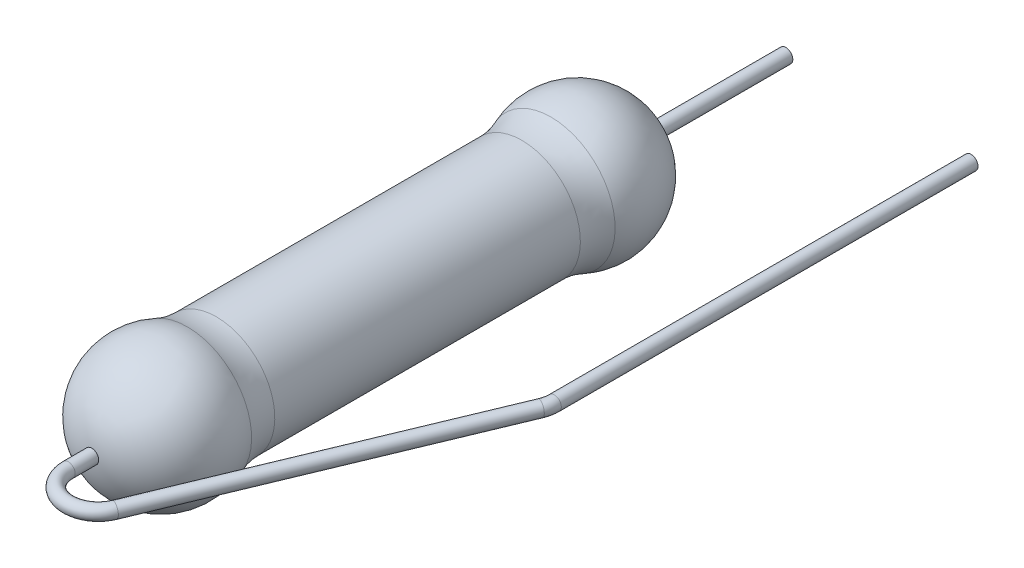
ISO-10303-21;
HEADER;
FILE_DESCRIPTION(('STEP AP214'),'2;1');
FILE_NAME('part.step','',(''),(''),'','','');
FILE_SCHEMA(('AUTOMOTIVE_DESIGN { 1 0 10303 214 1 1 1 1 }'));
ENDSEC;
DATA;
#1=APPLICATION_CONTEXT('core data for automotive mechanical design processes');
#2=APPLICATION_PROTOCOL_DEFINITION('international standard','automotive_design',2000,#1);
#3=PRODUCT_CONTEXT('',#1,'mechanical');
#4=PRODUCT('Part','Part','',(#3));
#5=PRODUCT_RELATED_PRODUCT_CATEGORY('part','',(#4));
#6=PRODUCT_DEFINITION_FORMATION('','',#4);
#7=PRODUCT_DEFINITION_CONTEXT('part definition',#1,'design');
#8=PRODUCT_DEFINITION('design','',#6,#7);
#9=PRODUCT_DEFINITION_SHAPE('','',#8);
#10=(LENGTH_UNIT() NAMED_UNIT(*) SI_UNIT(.MILLI.,.METRE.));
#11=(NAMED_UNIT(*) PLANE_ANGLE_UNIT() SI_UNIT($,.RADIAN.));
#12=(NAMED_UNIT(*) SI_UNIT($,.STERADIAN.) SOLID_ANGLE_UNIT());
#13=UNCERTAINTY_MEASURE_WITH_UNIT(LENGTH_MEASURE(1.E-05),#10,'distance_accuracy_value','');
#14=(GEOMETRIC_REPRESENTATION_CONTEXT(3) GLOBAL_UNCERTAINTY_ASSIGNED_CONTEXT((#13)) GLOBAL_UNIT_ASSIGNED_CONTEXT((#10,
#11,#12)) REPRESENTATION_CONTEXT('',''));
#15=CARTESIAN_POINT('',(0.,0.,0.));
#16=DIRECTION('',(0.,0.,1.));
#17=DIRECTION('',(1.,0.,0.));
#18=AXIS2_PLACEMENT_3D('',#15,#16,#17);
#19=CARTESIAN_POINT('',(0.,0.,-2.));
#20=DIRECTION('',(0.,0.,1.));
#21=DIRECTION('',(1.,0.,0.));
#22=AXIS2_PLACEMENT_3D('',#19,#20,#21);
#23=CYLINDRICAL_SURFACE('',#22,0.15);
#24=CARTESIAN_POINT('',(0.,0.,-2.));
#25=DIRECTION('',(0.,0.,1.));
#26=DIRECTION('',(1.,0.,0.));
#27=AXIS2_PLACEMENT_3D('',#24,#25,#26);
#28=CIRCLE('',#27,0.15);
#29=CARTESIAN_POINT('',(0.15,0.,-2.));
#30=VERTEX_POINT('',#29);
#31=EDGE_CURVE('E10',#30,#30,#28,.T.);
#32=ORIENTED_EDGE('',*,*,#31,.T.);
#33=EDGE_LOOP('',(#32));
#34=FACE_BOUND('',#33,.T.);
#35=CARTESIAN_POINT('',(0.,0.,1.00751884434007));
#36=DIRECTION('',(0.,0.,-1.));
#37=DIRECTION('',(0.,1.,0.));
#38=AXIS2_PLACEMENT_3D('',#35,#36,#37);
#39=CIRCLE('',#38,0.150000000000014);
#40=CARTESIAN_POINT('',(0.,0.15,1.00751884434007));
#41=VERTEX_POINT('',#40);
#42=EDGE_CURVE('E65',#41,#41,#39,.T.);
#43=ORIENTED_EDGE('',*,*,#42,.T.);
#44=EDGE_LOOP('',(#43));
#45=FACE_BOUND('',#44,.T.);
#46=ADVANCED_FACE('F43',(#34,#45),#23,.T.);
#47=CARTESIAN_POINT('',(0.,0.,-2.));
#48=DIRECTION('',(0.,0.,1.));
#49=DIRECTION('',(1.,0.,0.));
#50=AXIS2_PLACEMENT_3D('',#47,#48,#49);
#51=PLANE('',#50);
#52=ORIENTED_EDGE('',*,*,#31,.F.);
#53=EDGE_LOOP('',(#52));
#54=FACE_BOUND('',#53,.T.);
#55=ADVANCED_FACE('F106',(#54),#51,.F.);
#56=CARTESIAN_POINT('',(0.,0.,3.69992652848196));
#57=DIRECTION('',(0.,0.,-1.));
#58=DIRECTION('',(0.,1.,0.));
#59=AXIS2_PLACEMENT_3D('',#56,#57,#58);
#60=TOROIDAL_SURFACE('',#59,2.89687889891239,1.63555912537439);
#61=CARTESIAN_POINT('',(0.,0.,3.07402514854764));
#62=DIRECTION('',(0.,0.,-1.));
#63=DIRECTION('',(0.,1.,0.));
#64=AXIS2_PLACEMENT_3D('',#61,#62,#63);
#65=CIRCLE('',#64,1.38581929876694);
#66=CARTESIAN_POINT('',(0.,1.38581929876693,3.07402514854764));
#67=VERTEX_POINT('',#66);
#68=EDGE_CURVE('E68',#67,#67,#65,.T.);
#69=ORIENTED_EDGE('',*,*,#68,.F.);
#70=EDGE_LOOP('',(#69));
#71=FACE_BOUND('',#70,.T.);
#72=CARTESIAN_POINT('',(0.,0.,3.69992652848196));
#73=DIRECTION('',(0.,0.,-1.));
#74=DIRECTION('',(0.,1.,0.));
#75=AXIS2_PLACEMENT_3D('',#72,#73,#74);
#76=CIRCLE('',#75,1.26131977353801);
#77=CARTESIAN_POINT('',(0.,1.261319773538,3.69992652848196));
#78=VERTEX_POINT('',#77);
#79=EDGE_CURVE('E50',#78,#78,#76,.T.);
#80=ORIENTED_EDGE('',*,*,#79,.T.);
#81=EDGE_LOOP('',(#80));
#82=FACE_BOUND('',#81,.T.);
#83=ADVANCED_FACE('F110',(#71,#82),#60,.F.);
#84=CARTESIAN_POINT('',(0.,0.,4.));
#85=DIRECTION('',(0.,0.,-1.));
#86=DIRECTION('',(0.,1.,0.));
#87=AXIS2_PLACEMENT_3D('',#84,#85,#86);
#88=CYLINDRICAL_SURFACE('',#87,1.26131977353801);
#89=ORIENTED_EDGE('',*,*,#79,.F.);
#90=EDGE_LOOP('',(#89));
#91=FACE_BOUND('',#90,.T.);
#92=CARTESIAN_POINT('',(0.,0.,10.3000734715181));
#93=DIRECTION('',(0.,0.,-1.));
#94=DIRECTION('',(0.,1.,0.));
#95=AXIS2_PLACEMENT_3D('',#92,#93,#94);
#96=CIRCLE('',#95,1.261319773538);
#97=CARTESIAN_POINT('',(0.,1.261319773538,10.3000734715181));
#98=VERTEX_POINT('',#97);
#99=EDGE_CURVE('E54',#98,#98,#96,.T.);
#100=ORIENTED_EDGE('',*,*,#99,.T.);
#101=EDGE_LOOP('',(#100));
#102=FACE_BOUND('',#101,.T.);
#103=ADVANCED_FACE('F133',(#91,#102),#88,.T.);
#104=CARTESIAN_POINT('',(0.,0.,10.3000734715181));
#105=DIRECTION('',(0.,0.,-1.));
#106=DIRECTION('',(0.,1.,0.));
#107=AXIS2_PLACEMENT_3D('',#104,#105,#106);
#108=TOROIDAL_SURFACE('',#107,2.89687889891239,1.63555912537439);
#109=ORIENTED_EDGE('',*,*,#99,.F.);
#110=EDGE_LOOP('',(#109));
#111=FACE_BOUND('',#110,.T.);
#112=CARTESIAN_POINT('',(0.,0.,10.9259748514524));
#113=DIRECTION('',(0.,0.,-1.));
#114=DIRECTION('',(0.,1.,0.));
#115=AXIS2_PLACEMENT_3D('',#112,#113,#114);
#116=CIRCLE('',#115,1.38581929876693);
#117=CARTESIAN_POINT('',(0.,1.38581929876693,10.9259748514524));
#118=VERTEX_POINT('',#117);
#119=EDGE_CURVE('E59',#118,#118,#116,.T.);
#120=ORIENTED_EDGE('',*,*,#119,.T.);
#121=EDGE_LOOP('',(#120));
#122=FACE_BOUND('',#121,.T.);
#123=ADVANCED_FACE('F129',(#111,#122),#108,.F.);
#124=CARTESIAN_POINT('',(0.,0.,11.5));
#125=DIRECTION('',(0.,0.,-1.));
#126=DIRECTION('',(0.,1.,0.));
#127=AXIS2_PLACEMENT_3D('',#124,#125,#126);
#128=SPHERICAL_SURFACE('',#127,1.5);
#129=CARTESIAN_POINT('',(0.,0.,12.9924811556599));
#130=DIRECTION('',(0.,0.,-1.));
#131=DIRECTION('',(0.,1.,0.));
#132=AXIS2_PLACEMENT_3D('',#129,#130,#131);
#133=CIRCLE('',#132,0.149999999999999);
#134=CARTESIAN_POINT('',(0.,0.150000000000002,12.9924811556599));
#135=VERTEX_POINT('',#134);
#136=EDGE_CURVE('E62',#135,#135,#133,.T.);
#137=CARTESIAN_POINT('',(0.,0.150000000000002,12.9924811556599));
#138=CARTESIAN_POINT('',(0.,0.178968722492178,12.9895707250717));
#139=CARTESIAN_POINT('',(0.,0.20785237363917,12.9858148856555));
#140=CARTESIAN_POINT('',(0.,0.265352342203524,12.9766295943144));
#141=CARTESIAN_POINT('',(0.,0.293968659620887,12.9712001423894));
#142=CARTESIAN_POINT('',(0.,0.350836769686725,12.9586848311779));
#143=CARTESIAN_POINT('',(0.,0.379088562335201,12.9515989718912));
#144=CARTESIAN_POINT('',(0.,0.43513191024601,12.9357951858277));
#145=CARTESIAN_POINT('',(0.,0.462923465508344,12.9270772590508));
#146=CARTESIAN_POINT('',(0.,0.517952121017094,12.9080388027284));
#147=CARTESIAN_POINT('',(0.,0.54518922126351,12.8977182731827));
#148=CARTESIAN_POINT('',(0.,0.59901664595659,12.8755096174565));
#149=CARTESIAN_POINT('',(0.,0.625606970403254,12.8636214912758));
#150=CARTESIAN_POINT('',(0.,0.678050710390966,12.8383179327873));
#151=CARTESIAN_POINT('',(0.,0.703904125932014,12.8249025004795));
#152=CARTESIAN_POINT('',(0.,0.75478641412377,12.7965898051266));
#153=CARTESIAN_POINT('',(0.,0.779815286774479,12.7816925420814));
#154=CARTESIAN_POINT('',(0.,0.828963649784261,12.750466681444));
#155=CARTESIAN_POINT('',(0.,0.853083140143335,12.7341380838518));
#156=CARTESIAN_POINT('',(0.,0.900330981753813,12.7001049026086));
#157=CARTESIAN_POINT('',(0.,0.923459333005217,12.6824003189575));
#158=CARTESIAN_POINT('',(0.,0.968646499183322,12.6456751780567));
#159=CARTESIAN_POINT('',(0.,0.990705314110023,12.6266546208071));
#160=CARTESIAN_POINT('',(0.,1.03367863579101,12.5873620059108));
#161=CARTESIAN_POINT('',(0.,1.0545931425453,12.5670899482642));
#162=CARTESIAN_POINT('',(0.,1.09520695484593,12.5253630479239));
#163=CARTESIAN_POINT('',(0.,1.11490626039227,12.5039082052302));
#164=CARTESIAN_POINT('',(0.,1.15302289635901,12.4598884593859));
#165=CARTESIAN_POINT('',(0.,1.1714402267794,12.4373235562352));
#166=CARTESIAN_POINT('',(0.,1.20693048403399,12.391160176792));
#167=CARTESIAN_POINT('',(0.,1.22400341086818,12.3675617004994));
#168=CARTESIAN_POINT('',(0.,1.25674698955914,12.3194111655478));
#169=CARTESIAN_POINT('',(0.,1.27241764141591,12.2948591068887));
#170=CARTESIAN_POINT('',(0.,1.30230355199408,12.2448846302979));
#171=CARTESIAN_POINT('',(0.,1.31651881071547,12.2194622123661));
#172=CARTESIAN_POINT('',(0.,1.34344575015064,12.1678331905443));
#173=CARTESIAN_POINT('',(0.,1.3561574308644,12.1416265866543));
#174=CARTESIAN_POINT('',(0.,1.38003412602793,12.0885180243533));
#175=CARTESIAN_POINT('',(0.,1.3911991404777,12.0616160659422));
#176=CARTESIAN_POINT('',(0.,1.41194465752748,12.0072079830504));
#177=CARTESIAN_POINT('',(0.,1.4215251601275,11.9797018585697));
#178=CARTESIAN_POINT('',(0.,1.43906917884531,11.9241786799069));
#179=CARTESIAN_POINT('',(0.,1.44703269496312,11.8961616257248));
#180=CARTESIAN_POINT('',(0.,1.46131574711876,11.8397115559037));
#181=CARTESIAN_POINT('',(0.,1.46763528315659,11.8112785402647));
#182=CARTESIAN_POINT('',(0.,1.47860895407521,11.7540929257453));
#183=CARTESIAN_POINT('',(0.,1.483263088956,11.7253403268649));
#184=CARTESIAN_POINT('',(0.,1.49089018166323,11.6676130073427));
#185=CARTESIAN_POINT('',(0.,1.49386313948968,11.6386382867009));
#186=CARTESIAN_POINT('',(0.,1.49811780066279,11.5805649381029));
#187=CARTESIAN_POINT('',(0.,1.49939950400946,11.5514663101467));
#188=CARTESIAN_POINT('',(0.,1.50026731211083,11.4932437811834));
#189=CARTESIAN_POINT('',(0.,1.49985341686553,11.4641198801764));
#190=CARTESIAN_POINT('',(0.,1.49733142916254,11.4059455257399));
#191=CARTESIAN_POINT('',(0.,1.49522333670486,11.3768950723104));
#192=CARTESIAN_POINT('',(0.,1.4893201062019,11.3189660820906));
#193=CARTESIAN_POINT('',(0.,1.48552496815662,11.2900875453002));
#194=CARTESIAN_POINT('',(0.,1.47626048863903,11.2326002844026));
#195=CARTESIAN_POINT('',(0.,1.47079114716673,11.2039915602953));
#196=CARTESIAN_POINT('',(0.,1.45819688232862,11.1471408699549));
#197=CARTESIAN_POINT('',(0.,1.4510719589628,11.1188989037218));
#198=CARTESIAN_POINT('',(0.,1.43519037412063,11.062877566536));
#199=CARTESIAN_POINT('',(0.,1.42643371264427,11.0350981955834));
#200=CARTESIAN_POINT('',(0.,1.40731948043477,10.980095813008));
#201=CARTESIAN_POINT('',(0.,1.39696190970161,10.9528728013853));
#202=CARTESIAN_POINT('',(0.,1.38581929876693,10.9259748514524));
#203=B_SPLINE_CURVE_WITH_KNOTS('',3,(#137,#138,#139,#140,#141,#142,#143,#144,#145,#146,#147,
#148,#149,#150,#151,#152,#153,#154,#155,#156,#157,#158,#159,#160,#161,#162,#163,#164,#165,#166,
#167,#168,#169,#170,#171,#172,#173,#174,#175,#176,#177,#178,#179,#180,#181,#182,#183,#184,#185,
#186,#187,#188,#189,#190,#191,#192,#193,#194,#195,#196,#197,#198,#199,#200,#201,#202),
.UNSPECIFIED.,.F.,.F.,(4,2,2,2,2,2,2,2,2,2,2,2,2,2,2,2,2,2,2,2,2,2,2,2,2,2,2,2,2,2,2,2,4),(0.,
0.0873311604166167,0.174662320833234,0.261993481249851,0.349324641666468,0.436655802083085,
0.523986962499702,0.611318122916319,0.698649283332935,0.785980443749553,0.873311604166169,
0.960642764582787,1.0479739249994,1.13530508541602,1.22263624583264,1.30996740624925,
1.39729856666587,1.48462972708249,1.5719608874991,1.65929204791572,1.74662320833234,
1.83395436874896,1.92128552916557,2.00861668958219,2.09594784999881,2.18327901041542,
2.27061017083204,2.35794133124866,2.44527249166527,2.53260365208189,2.61993481249851,
2.70726597291513,2.79459713333174),.UNSPECIFIED.);
#204=EDGE_CURVE('BSEAM122',#135,#118,#203,.T.);
#205=ORIENTED_EDGE('',*,*,#136,.T.);
#206=ORIENTED_EDGE('',*,*,#119,.F.);
#207=ORIENTED_EDGE('',*,*,#204,.T.);
#208=ORIENTED_EDGE('',*,*,#204,.F.);
#209=EDGE_LOOP('',(#205,#207,#206,#208));
#210=FACE_BOUND('',#209,.T.);
#211=ADVANCED_FACE('F122',(#210),#128,.T.);
#212=CARTESIAN_POINT('',(0.,0.,4.));
#213=DIRECTION('',(0.,0.,-1.));
#214=DIRECTION('',(0.,1.,0.));
#215=AXIS2_PLACEMENT_3D('',#212,#213,#214);
#216=CYLINDRICAL_SURFACE('',#215,0.149999999999999);
#217=ORIENTED_EDGE('',*,*,#136,.F.);
#218=EDGE_LOOP('',(#217));
#219=FACE_BOUND('',#218,.T.);
#220=CARTESIAN_POINT('',(0.,0.,13.5));
#221=DIRECTION('',(0.,0.,1.));
#222=DIRECTION('',(1.,0.,0.));
#223=AXIS2_PLACEMENT_3D('',#220,#221,#222);
#224=CIRCLE('',#223,0.149999999999998);
#225=CARTESIAN_POINT('',(-0.149999999999998,0.,13.5));
#226=VERTEX_POINT('',#225);
#227=EDGE_CURVE('E46',#226,#226,#224,.T.);
#228=ORIENTED_EDGE('',*,*,#227,.F.);
#229=EDGE_LOOP('',(#228));
#230=FACE_BOUND('',#229,.T.);
#231=ADVANCED_FACE('F116',(#219,#230),#216,.T.);
#232=CARTESIAN_POINT('',(0.,0.,2.5));
#233=DIRECTION('',(0.,0.,-1.));
#234=DIRECTION('',(0.,1.,0.));
#235=AXIS2_PLACEMENT_3D('',#232,#233,#234);
#236=SPHERICAL_SURFACE('',#235,1.5);
#237=CARTESIAN_POINT('',(0.,1.38581929876693,3.07402514854764));
#238=CARTESIAN_POINT('',(0.,1.39696190970161,3.04712719861468));
#239=CARTESIAN_POINT('',(0.,1.40731948043476,3.01990418699199));
#240=CARTESIAN_POINT('',(0.,1.42643371264427,2.96490180441665));
#241=CARTESIAN_POINT('',(0.,1.43519037412063,2.937122433464));
#242=CARTESIAN_POINT('',(0.,1.4510719589628,2.88110109627821));
#243=CARTESIAN_POINT('',(0.,1.45819688232862,2.85285913004507));
#244=CARTESIAN_POINT('',(0.,1.47079114716673,2.79600843970467));
#245=CARTESIAN_POINT('',(0.,1.47626048863903,2.7673997155974));
#246=CARTESIAN_POINT('',(0.,1.48552496815662,2.70991245469977));
#247=CARTESIAN_POINT('',(0.,1.4893201062019,2.6810339179094));
#248=CARTESIAN_POINT('',(0.,1.49522333670486,2.62310492768959));
#249=CARTESIAN_POINT('',(0.,1.49733142916254,2.59405447426014));
#250=CARTESIAN_POINT('',(0.,1.49985341686553,2.53588011982364));
#251=CARTESIAN_POINT('',(0.,1.50026731211083,2.50675621881658));
#252=CARTESIAN_POINT('',(0.,1.49939950400946,2.44853368985332));
#253=CARTESIAN_POINT('',(0.,1.49811780066279,2.41943506189713));
#254=CARTESIAN_POINT('',(0.,1.49386313948968,2.36136171329911));
#255=CARTESIAN_POINT('',(0.,1.49089018166323,2.33238699265728));
#256=CARTESIAN_POINT('',(0.,1.483263088956,2.27465967313506));
#257=CARTESIAN_POINT('',(0.,1.47860895407522,2.24590707425465));
#258=CARTESIAN_POINT('',(0.,1.46763528315659,2.18872145973528));
#259=CARTESIAN_POINT('',(0.,1.46131574711876,2.16028844409632));
#260=CARTESIAN_POINT('',(0.,1.44703269496312,2.10383837427525));
#261=CARTESIAN_POINT('',(0.,1.43906917884532,2.07582132009314));
#262=CARTESIAN_POINT('',(0.,1.4215251601275,2.02029814143029));
#263=CARTESIAN_POINT('',(0.,1.41194465752748,1.99279201694955));
#264=CARTESIAN_POINT('',(0.,1.3911991404777,1.93838393405776));
#265=CARTESIAN_POINT('',(0.,1.38003412602793,1.9114819756467));
#266=CARTESIAN_POINT('',(0.,1.3561574308644,1.85837341334566));
#267=CARTESIAN_POINT('',(0.,1.34344575015064,1.83216680945568));
#268=CARTESIAN_POINT('',(0.,1.31651881071548,1.78053778763391));
#269=CARTESIAN_POINT('',(0.,1.30230355199408,1.75511536970212));
#270=CARTESIAN_POINT('',(0.,1.27241764141591,1.70514089311125));
#271=CARTESIAN_POINT('',(0.,1.25674698955914,1.68058883445218));
#272=CARTESIAN_POINT('',(0.,1.22400341086818,1.63243829950056));
#273=CARTESIAN_POINT('',(0.,1.20693048403399,1.60883982320802));
#274=CARTESIAN_POINT('',(0.,1.1714402267794,1.5626764437648));
#275=CARTESIAN_POINT('',(0.,1.15302289635901,1.54011154061412));
#276=CARTESIAN_POINT('',(0.,1.11490626039227,1.49609179476975));
#277=CARTESIAN_POINT('',(0.,1.09520695484593,1.47463695207608));
#278=CARTESIAN_POINT('',(0.,1.0545931425453,1.4329100517358));
#279=CARTESIAN_POINT('',(0.,1.03367863579101,1.41263799408921));
#280=CARTESIAN_POINT('',(0.,0.990705314110023,1.37334537919294));
#281=CARTESIAN_POINT('',(0.,0.968646499183322,1.35432482194325));
#282=CARTESIAN_POINT('',(0.,0.923459333005217,1.3175996810425));
#283=CARTESIAN_POINT('',(0.,0.900330981753813,1.29989509739143));
#284=CARTESIAN_POINT('',(0.,0.853083140143335,1.26586191614816));
#285=CARTESIAN_POINT('',(0.,0.82896364978426,1.24953331855596));
#286=CARTESIAN_POINT('',(0.,0.779815286774478,1.2183074579186));
#287=CARTESIAN_POINT('',(0.,0.75478641412377,1.20341019487344));
#288=CARTESIAN_POINT('',(0.,0.703904125932013,1.1750974995205));
#289=CARTESIAN_POINT('',(0.,0.678050710390965,1.1616820672127));
#290=CARTESIAN_POINT('',(0.,0.625606970403253,1.13637850872423));
#291=CARTESIAN_POINT('',(0.,0.599016645956589,1.12449038254355));
#292=CARTESIAN_POINT('',(0.,0.545189221263509,1.10228172681726));
#293=CARTESIAN_POINT('',(0.,0.517952121017093,1.09196119727165));
#294=CARTESIAN_POINT('',(0.,0.462923465508343,1.07292274094915));
#295=CARTESIAN_POINT('',(0.,0.435131910246009,1.06420481417227));
#296=CARTESIAN_POINT('',(0.,0.379088562335199,1.04840102810876));
#297=CARTESIAN_POINT('',(0.,0.350836769686724,1.04131516882214));
#298=CARTESIAN_POINT('',(0.,0.293968659620886,1.02879985761056));
#299=CARTESIAN_POINT('',(0.,0.265352342203523,1.02337040568561));
#300=CARTESIAN_POINT('',(0.,0.207852373639168,1.01418511434447));
#301=CARTESIAN_POINT('',(0.,0.178968722492177,1.0104292749283));
#302=CARTESIAN_POINT('',(0.,0.15,1.00751884434007));
#303=B_SPLINE_CURVE_WITH_KNOTS('',3,(#237,#238,#239,#240,#241,#242,#243,#244,#245,#246,#247,
#248,#249,#250,#251,#252,#253,#254,#255,#256,#257,#258,#259,#260,#261,#262,#263,#264,#265,#266,
#267,#268,#269,#270,#271,#272,#273,#274,#275,#276,#277,#278,#279,#280,#281,#282,#283,#284,#285,
#286,#287,#288,#289,#290,#291,#292,#293,#294,#295,#296,#297,#298,#299,#300,#301,#302),
.UNSPECIFIED.,.F.,.F.,(4,2,2,2,2,2,2,2,2,2,2,2,2,2,2,2,2,2,2,2,2,2,2,2,2,2,2,2,2,2,2,2,4),(0.,
0.0873311604166174,0.174662320833234,0.261993481249851,0.349324641666469,0.436655802083086,
0.523986962499703,0.61131812291632,0.698649283332937,0.785980443749554,0.873311604166171,
0.960642764582788,1.04797392499941,1.13530508541602,1.22263624583264,1.30996740624926,
1.39729856666587,1.48462972708249,1.57196088749911,1.65929204791572,1.74662320833234,
1.83395436874896,1.92128552916558,2.00861668958219,2.09594784999881,2.18327901041543,
2.27061017083204,2.35794133124866,2.44527249166528,2.5326036520819,2.61993481249851,
2.70726597291513,2.79459713333175),.UNSPECIFIED.);
#304=EDGE_CURVE('BSEAM101',#67,#41,#303,.T.);
#305=ORIENTED_EDGE('',*,*,#68,.T.);
#306=ORIENTED_EDGE('',*,*,#42,.F.);
#307=ORIENTED_EDGE('',*,*,#304,.T.);
#308=ORIENTED_EDGE('',*,*,#304,.F.);
#309=EDGE_LOOP('',(#305,#307,#306,#308));
#310=FACE_BOUND('',#309,.T.);
#311=ADVANCED_FACE('F101',(#310),#236,.T.);
#312=CARTESIAN_POINT('',(0.649999999999999,0.,13.5));
#313=DIRECTION('',(0.,1.,0.));
#314=DIRECTION('',(0.,0.,1.));
#315=AXIS2_PLACEMENT_3D('',#312,#313,#314);
#316=TOROIDAL_SURFACE('',#315,0.649999999999997,0.15);
#317=CARTESIAN_POINT('',(1.25027286555425,0.,13.7493441133841));
#318=DIRECTION('',(-0.38360632828319,0.,0.923496716237307));
#319=DIRECTION('',(0.923496716237307,0.,0.38360632828319));
#320=AXIS2_PLACEMENT_3D('',#317,#318,#319);
#321=CIRCLE('',#320,0.15);
#322=CARTESIAN_POINT('',(1.38879737298984,0.,13.8068850626266));
#323=VERTEX_POINT('',#322);
#324=EDGE_CURVE('E74',#323,#323,#321,.T.);
#325=CARTESIAN_POINT('',(0.649999999999999,0.,13.5));
#326=DIRECTION('',(0.,1.,0.));
#327=DIRECTION('',(0.,0.,1.));
#328=AXIS2_PLACEMENT_3D('',#325,#326,#327);
#329=CIRCLE('',#328,0.799999999999997);
#330=EDGE_CURVE('',#226,#323,#329,.T.);
#331=ORIENTED_EDGE('',*,*,#227,.T.);
#332=ORIENTED_EDGE('',*,*,#324,.T.);
#333=ORIENTED_EDGE('',*,*,#330,.T.);
#334=ORIENTED_EDGE('',*,*,#330,.F.);
#335=EDGE_LOOP('',(#331,#333,#332,#334));
#336=FACE_BOUND('',#335,.T.);
#337=ADVANCED_FACE('F92',(#336),#316,.T.);
#338=CARTESIAN_POINT('',(1.25027286555425,0.,13.7493441133841));
#339=DIRECTION('',(0.38360632828319,0.,-0.923496716237307));
#340=DIRECTION('',(-0.923496716237307,0.,-0.38360632828319));
#341=AXIS2_PLACEMENT_3D('',#338,#339,#340);
#342=CYLINDRICAL_SURFACE('',#341,0.15);
#343=CARTESIAN_POINT('',(3.95027286555425,0.,7.24934411338407));
#344=DIRECTION('',(-0.38360632828319,0.,0.923496716237307));
#345=DIRECTION('',(0.923496716237307,0.,0.38360632828319));
#346=AXIS2_PLACEMENT_3D('',#343,#344,#345);
#347=CIRCLE('',#346,0.15);
#348=CARTESIAN_POINT('',(4.08879737298985,0.,7.30688506262655));
#349=VERTEX_POINT('',#348);
#350=EDGE_CURVE('E71',#349,#349,#347,.T.);
#351=ORIENTED_EDGE('',*,*,#350,.T.);
#352=EDGE_LOOP('',(#351));
#353=FACE_BOUND('',#352,.T.);
#354=ORIENTED_EDGE('',*,*,#324,.F.);
#355=EDGE_LOOP('',(#354));
#356=FACE_BOUND('',#355,.T.);
#357=ADVANCED_FACE('F99',(#353,#356),#342,.T.);
#358=CARTESIAN_POINT('',(3.35,0.,7.));
#359=DIRECTION('',(0.,1.,0.));
#360=DIRECTION('',(0.,0.,1.));
#361=AXIS2_PLACEMENT_3D('',#358,#359,#360);
#362=TOROIDAL_SURFACE('',#361,0.649999999999998,0.15);
#363=CARTESIAN_POINT('',(4.,0.,7.));
#364=DIRECTION('',(0.,0.,1.));
#365=DIRECTION('',(1.,0.,0.));
#366=AXIS2_PLACEMENT_3D('',#363,#364,#365);
#367=CIRCLE('',#366,0.15);
#368=CARTESIAN_POINT('',(4.15,0.,7.));
#369=VERTEX_POINT('',#368);
#370=EDGE_CURVE('E80',#369,#369,#367,.T.);
#371=CARTESIAN_POINT('',(3.35,0.,7.));
#372=DIRECTION('',(0.,1.,0.));
#373=DIRECTION('',(0.,0.,1.));
#374=AXIS2_PLACEMENT_3D('',#371,#372,#373);
#375=CIRCLE('',#374,0.799999999999998);
#376=EDGE_CURVE('',#349,#369,#375,.T.);
#377=ORIENTED_EDGE('',*,*,#350,.F.);
#378=ORIENTED_EDGE('',*,*,#370,.T.);
#379=ORIENTED_EDGE('',*,*,#376,.T.);
#380=ORIENTED_EDGE('',*,*,#376,.F.);
#381=EDGE_LOOP('',(#377,#379,#378,#380));
#382=FACE_BOUND('',#381,.T.);
#383=ADVANCED_FACE('F84',(#382),#362,.T.);
#384=CARTESIAN_POINT('',(4.,0.,-2.));
#385=DIRECTION('',(0.,0.,1.));
#386=DIRECTION('',(1.,0.,0.));
#387=AXIS2_PLACEMENT_3D('',#384,#385,#386);
#388=CYLINDRICAL_SURFACE('',#387,0.15);
#389=CARTESIAN_POINT('',(4.,0.,-2.));
#390=DIRECTION('',(0.,0.,1.));
#391=DIRECTION('',(1.,0.,0.));
#392=AXIS2_PLACEMENT_3D('',#389,#390,#391);
#393=CIRCLE('',#392,0.15);
#394=CARTESIAN_POINT('',(4.15,0.,-2.));
#395=VERTEX_POINT('',#394);
#396=EDGE_CURVE('E77',#395,#395,#393,.T.);
#397=ORIENTED_EDGE('',*,*,#396,.T.);
#398=EDGE_LOOP('',(#397));
#399=FACE_BOUND('',#398,.T.);
#400=ORIENTED_EDGE('',*,*,#370,.F.);
#401=EDGE_LOOP('',(#400));
#402=FACE_BOUND('',#401,.T.);
#403=ADVANCED_FACE('F87',(#399,#402),#388,.T.);
#404=CARTESIAN_POINT('',(0.,0.,-2.));
#405=DIRECTION('',(0.,0.,1.));
#406=DIRECTION('',(1.,0.,0.));
#407=AXIS2_PLACEMENT_3D('',#404,#405,#406);
#408=PLANE('',#407);
#409=ORIENTED_EDGE('',*,*,#396,.F.);
#410=EDGE_LOOP('',(#409));
#411=FACE_BOUND('',#410,.T.);
#412=ADVANCED_FACE('F89',(#411),#408,.F.);
#413=CLOSED_SHELL('',(#46,#55,#83,#103,#123,#211,#231,#311,#337,#357,#383,#403,#412));
#414=MANIFOLD_SOLID_BREP('B2',#413);
#415=ADVANCED_BREP_SHAPE_REPRESENTATION('',(#18,#414),#14);
#416=SHAPE_DEFINITION_REPRESENTATION(#9,#415);
ENDSEC;
END-ISO-10303-21;
